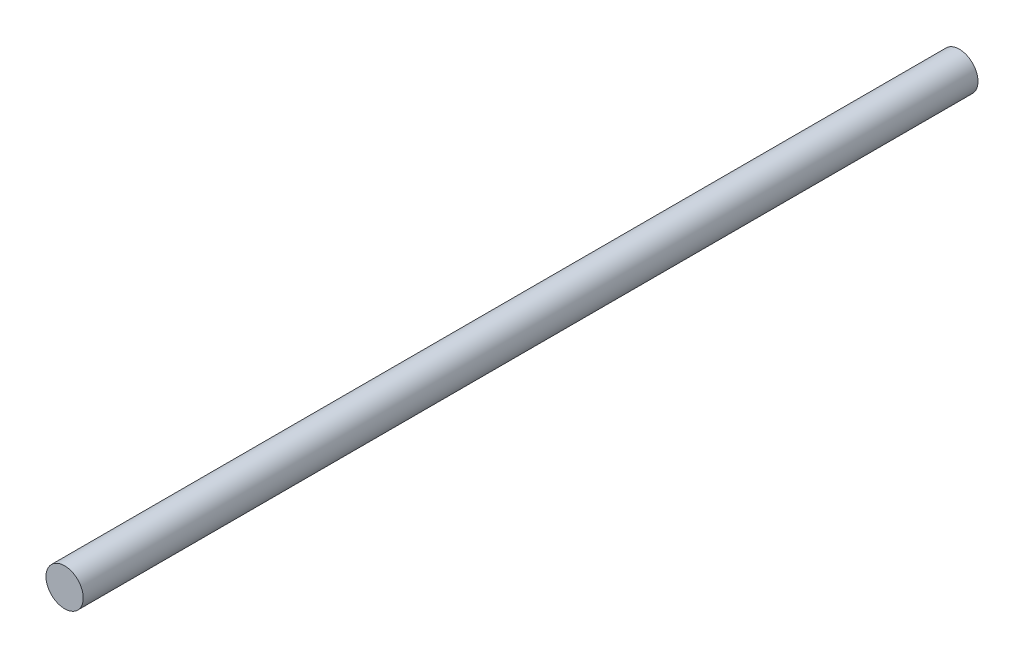
ISO-10303-21;
HEADER;
FILE_DESCRIPTION(('STEP AP214'),'2;1');
FILE_NAME('part.step','',(''),(''),'','','');
FILE_SCHEMA(('AUTOMOTIVE_DESIGN { 1 0 10303 214 1 1 1 1 }'));
ENDSEC;
DATA;
#1=APPLICATION_CONTEXT('core data for automotive mechanical design processes');
#2=APPLICATION_PROTOCOL_DEFINITION('international standard','automotive_design',2000,#1);
#3=PRODUCT_CONTEXT('',#1,'mechanical');
#4=PRODUCT('Part','Part','',(#3));
#5=PRODUCT_RELATED_PRODUCT_CATEGORY('part','',(#4));
#6=PRODUCT_DEFINITION_FORMATION('','',#4);
#7=PRODUCT_DEFINITION_CONTEXT('part definition',#1,'design');
#8=PRODUCT_DEFINITION('design','',#6,#7);
#9=PRODUCT_DEFINITION_SHAPE('','',#8);
#10=(LENGTH_UNIT() NAMED_UNIT(*) SI_UNIT(.MILLI.,.METRE.));
#11=(NAMED_UNIT(*) PLANE_ANGLE_UNIT() SI_UNIT($,.RADIAN.));
#12=(NAMED_UNIT(*) SI_UNIT($,.STERADIAN.) SOLID_ANGLE_UNIT());
#13=UNCERTAINTY_MEASURE_WITH_UNIT(LENGTH_MEASURE(1.E-05),#10,'distance_accuracy_value','');
#14=(GEOMETRIC_REPRESENTATION_CONTEXT(3) GLOBAL_UNCERTAINTY_ASSIGNED_CONTEXT((#13)) GLOBAL_UNIT_ASSIGNED_CONTEXT((#10,
#11,#12)) REPRESENTATION_CONTEXT('',''));
#15=CARTESIAN_POINT('',(0.,0.,0.));
#16=DIRECTION('',(0.,0.,1.));
#17=DIRECTION('',(1.,0.,0.));
#18=AXIS2_PLACEMENT_3D('',#15,#16,#17);
#19=CARTESIAN_POINT('',(0.,0.,120.));
#20=DIRECTION('',(0.,0.,-1.));
#21=DIRECTION('',(-1.,0.,0.));
#22=AXIS2_PLACEMENT_3D('',#19,#20,#21);
#23=CYLINDRICAL_SURFACE('',#22,2.5);
#24=CARTESIAN_POINT('',(0.,0.,120.));
#25=DIRECTION('',(0.,0.,1.));
#26=DIRECTION('',(1.,0.,0.));
#27=AXIS2_PLACEMENT_3D('',#24,#25,#26);
#28=CIRCLE('',#27,2.5);
#29=CARTESIAN_POINT('',(2.5,0.,120.));
#30=VERTEX_POINT('',#29);
#31=EDGE_CURVE('E10',#30,#30,#28,.T.);
#32=ORIENTED_EDGE('',*,*,#31,.F.);
#33=EDGE_LOOP('',(#32));
#34=FACE_BOUND('',#33,.T.);
#35=CARTESIAN_POINT('',(0.,0.,0.));
#36=DIRECTION('',(0.,0.,1.));
#37=DIRECTION('',(1.,0.,0.));
#38=AXIS2_PLACEMENT_3D('',#35,#36,#37);
#39=CIRCLE('',#38,2.5);
#40=CARTESIAN_POINT('',(2.5,0.,0.));
#41=VERTEX_POINT('',#40);
#42=EDGE_CURVE('E46',#41,#41,#39,.T.);
#43=ORIENTED_EDGE('',*,*,#42,.T.);
#44=EDGE_LOOP('',(#43));
#45=FACE_BOUND('',#44,.T.);
#46=ADVANCED_FACE('F43',(#34,#45),#23,.T.);
#47=CARTESIAN_POINT('',(0.,0.,120.));
#48=DIRECTION('',(0.,0.,1.));
#49=DIRECTION('',(1.,0.,0.));
#50=AXIS2_PLACEMENT_3D('',#47,#48,#49);
#51=PLANE('',#50);
#52=ORIENTED_EDGE('',*,*,#31,.T.);
#53=EDGE_LOOP('',(#52));
#54=FACE_BOUND('',#53,.T.);
#55=ADVANCED_FACE('F60',(#54),#51,.T.);
#56=CARTESIAN_POINT('',(0.,0.,0.));
#57=DIRECTION('',(0.,0.,1.));
#58=DIRECTION('',(1.,0.,0.));
#59=AXIS2_PLACEMENT_3D('',#56,#57,#58);
#60=PLANE('',#59);
#61=ORIENTED_EDGE('',*,*,#42,.F.);
#62=EDGE_LOOP('',(#61));
#63=FACE_BOUND('',#62,.T.);
#64=ADVANCED_FACE('F58',(#63),#60,.F.);
#65=CLOSED_SHELL('',(#46,#55,#64));
#66=MANIFOLD_SOLID_BREP('B2',#65);
#67=ADVANCED_BREP_SHAPE_REPRESENTATION('',(#18,#66),#14);
#68=SHAPE_DEFINITION_REPRESENTATION(#9,#67);
ENDSEC;
END-ISO-10303-21;
